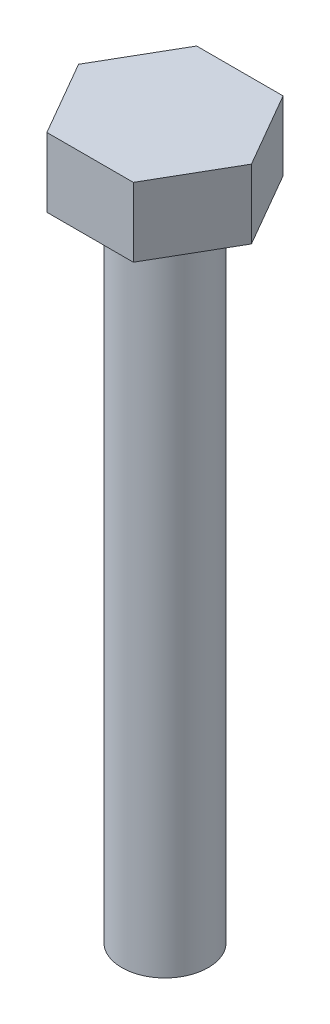
ISO-10303-21;
HEADER;
FILE_DESCRIPTION(('STEP AP214'),'2;1');
FILE_NAME('part.step','',(''),(''),'','','');
FILE_SCHEMA(('AUTOMOTIVE_DESIGN { 1 0 10303 214 1 1 1 1 }'));
ENDSEC;
DATA;
#1=APPLICATION_CONTEXT('core data for automotive mechanical design processes');
#2=APPLICATION_PROTOCOL_DEFINITION('international standard','automotive_design',2000,#1);
#3=PRODUCT_CONTEXT('',#1,'mechanical');
#4=PRODUCT('Part','Part','',(#3));
#5=PRODUCT_RELATED_PRODUCT_CATEGORY('part','',(#4));
#6=PRODUCT_DEFINITION_FORMATION('','',#4);
#7=PRODUCT_DEFINITION_CONTEXT('part definition',#1,'design');
#8=PRODUCT_DEFINITION('design','',#6,#7);
#9=PRODUCT_DEFINITION_SHAPE('','',#8);
#10=(LENGTH_UNIT() NAMED_UNIT(*) SI_UNIT(.MILLI.,.METRE.));
#11=(NAMED_UNIT(*) PLANE_ANGLE_UNIT() SI_UNIT($,.RADIAN.));
#12=(NAMED_UNIT(*) SI_UNIT($,.STERADIAN.) SOLID_ANGLE_UNIT());
#13=UNCERTAINTY_MEASURE_WITH_UNIT(LENGTH_MEASURE(1.E-05),#10,'distance_accuracy_value','');
#14=(GEOMETRIC_REPRESENTATION_CONTEXT(3) GLOBAL_UNCERTAINTY_ASSIGNED_CONTEXT((#13)) GLOBAL_UNIT_ASSIGNED_CONTEXT((#10,
#11,#12)) REPRESENTATION_CONTEXT('',''));
#15=CARTESIAN_POINT('',(0.,0.,0.));
#16=DIRECTION('',(0.,0.,1.));
#17=DIRECTION('',(1.,0.,0.));
#18=AXIS2_PLACEMENT_3D('',#15,#16,#17);
#19=CARTESIAN_POINT('',(0.,75.,0.));
#20=DIRECTION('',(0.,-1.,0.));
#21=DIRECTION('',(0.,0.,-1.));
#22=AXIS2_PLACEMENT_3D('',#19,#20,#21);
#23=CYLINDRICAL_SURFACE('',#22,5.);
#24=CARTESIAN_POINT('',(0.,75.,0.));
#25=DIRECTION('',(0.,1.,0.));
#26=DIRECTION('',(0.,0.,1.));
#27=AXIS2_PLACEMENT_3D('',#24,#25,#26);
#28=CIRCLE('',#27,5.);
#29=CARTESIAN_POINT('',(0.,75.,5.));
#30=VERTEX_POINT('',#29);
#31=EDGE_CURVE('E11',#30,#30,#28,.T.);
#32=ORIENTED_EDGE('',*,*,#31,.F.);
#33=EDGE_LOOP('',(#32));
#34=FACE_BOUND('',#33,.T.);
#35=CARTESIAN_POINT('',(0.,0.,0.));
#36=DIRECTION('',(0.,1.,0.));
#37=DIRECTION('',(0.,0.,1.));
#38=AXIS2_PLACEMENT_3D('',#35,#36,#37);
#39=CIRCLE('',#38,5.);
#40=CARTESIAN_POINT('',(0.,0.,5.));
#41=VERTEX_POINT('',#40);
#42=EDGE_CURVE('E36',#41,#41,#39,.T.);
#43=ORIENTED_EDGE('',*,*,#42,.T.);
#44=EDGE_LOOP('',(#43));
#45=FACE_BOUND('',#44,.T.);
#46=ADVANCED_FACE('F33',(#34,#45),#23,.T.);
#47=CARTESIAN_POINT('',(0.,0.,0.));
#48=DIRECTION('',(0.,1.,0.));
#49=DIRECTION('',(0.,0.,1.));
#50=AXIS2_PLACEMENT_3D('',#47,#48,#49);
#51=PLANE('',#50);
#52=ORIENTED_EDGE('',*,*,#42,.F.);
#53=EDGE_LOOP('',(#52));
#54=FACE_BOUND('',#53,.T.);
#55=ADVANCED_FACE('F141',(#54),#51,.F.);
#56=CARTESIAN_POINT('',(-9.99999999999998,83.,0.));
#57=DIRECTION('',(0.86602540378444,0.,0.499999999999998));
#58=DIRECTION('',(0.499999999999998,0.,-0.86602540378444));
#59=AXIS2_PLACEMENT_3D('',#56,#57,#58);
#60=PLANE('',#59);
#61=DIRECTION('',(-0.499999999999998,0.,0.86602540378444));
#62=VECTOR('',#61,1.);
#63=CARTESIAN_POINT('',(-9.99999999999998,75.,0.));
#64=LINE('',#63,#62);
#65=CARTESIAN_POINT('',(-5.,75.,-8.66025403784436));
#66=VERTEX_POINT('',#65);
#67=CARTESIAN_POINT('',(-9.99999999999998,75.,0.));
#68=VERTEX_POINT('',#67);
#69=EDGE_CURVE('E118',#66,#68,#64,.T.);
#70=ORIENTED_EDGE('',*,*,#69,.T.);
#71=DIRECTION('',(0.,-1.,0.));
#72=VECTOR('',#71,1.);
#73=CARTESIAN_POINT('',(-9.99999999999998,83.,0.));
#74=LINE('',#73,#72);
#75=CARTESIAN_POINT('',(-9.99999999999998,83.,0.));
#76=VERTEX_POINT('',#75);
#77=EDGE_CURVE('E135',#76,#68,#74,.T.);
#78=ORIENTED_EDGE('',*,*,#77,.F.);
#79=DIRECTION('',(-0.499999999999998,0.,0.86602540378444));
#80=VECTOR('',#79,1.);
#81=CARTESIAN_POINT('',(-9.99999999999998,83.,0.));
#82=LINE('',#81,#80);
#83=CARTESIAN_POINT('',(-5.,83.,-8.66025403784436));
#84=VERTEX_POINT('',#83);
#85=EDGE_CURVE('E128',#84,#76,#82,.T.);
#86=ORIENTED_EDGE('',*,*,#85,.F.);
#87=DIRECTION('',(0.,-1.,0.));
#88=VECTOR('',#87,1.);
#89=CARTESIAN_POINT('',(-5.,83.,-8.66025403784436));
#90=LINE('',#89,#88);
#91=EDGE_CURVE('E114',#84,#66,#90,.T.);
#92=ORIENTED_EDGE('',*,*,#91,.T.);
#93=EDGE_LOOP('',(#70,#78,#86,#92));
#94=FACE_BOUND('',#93,.T.);
#95=ADVANCED_FACE('F143',(#94),#60,.F.);
#96=CARTESIAN_POINT('',(-4.99999999999996,83.,8.66025403784441));
#97=DIRECTION('',(0.866025403784437,0.,-0.500000000000002));
#98=DIRECTION('',(-0.500000000000002,0.,-0.866025403784437));
#99=AXIS2_PLACEMENT_3D('',#96,#97,#98);
#100=PLANE('',#99);
#101=DIRECTION('',(0.500000000000002,0.,0.866025403784437));
#102=VECTOR('',#101,1.);
#103=CARTESIAN_POINT('',(-4.99999999999996,75.,8.66025403784441));
#104=LINE('',#103,#102);
#105=CARTESIAN_POINT('',(-4.99999999999996,75.,8.66025403784441));
#106=VERTEX_POINT('',#105);
#107=EDGE_CURVE('E121',#68,#106,#104,.T.);
#108=ORIENTED_EDGE('',*,*,#107,.T.);
#109=DIRECTION('',(0.,-1.,0.));
#110=VECTOR('',#109,1.);
#111=CARTESIAN_POINT('',(-4.99999999999996,83.,8.66025403784441));
#112=LINE('',#111,#110);
#113=CARTESIAN_POINT('',(-4.99999999999996,83.,8.66025403784441));
#114=VERTEX_POINT('',#113);
#115=EDGE_CURVE('E132',#114,#106,#112,.T.);
#116=ORIENTED_EDGE('',*,*,#115,.F.);
#117=DIRECTION('',(0.500000000000002,0.,0.866025403784437));
#118=VECTOR('',#117,1.);
#119=CARTESIAN_POINT('',(-4.99999999999996,83.,8.66025403784441));
#120=LINE('',#119,#118);
#121=EDGE_CURVE('E87',#76,#114,#120,.T.);
#122=ORIENTED_EDGE('',*,*,#121,.F.);
#123=ORIENTED_EDGE('',*,*,#77,.T.);
#124=EDGE_LOOP('',(#108,#116,#122,#123));
#125=FACE_BOUND('',#124,.T.);
#126=ADVANCED_FACE('F148',(#125),#100,.F.);
#127=CARTESIAN_POINT('',(5.00000000000004,83.,8.66025403784443));
#128=DIRECTION('',(0.,0.,-1.));
#129=DIRECTION('',(-1.,0.,0.));
#130=AXIS2_PLACEMENT_3D('',#127,#128,#129);
#131=PLANE('',#130);
#132=DIRECTION('',(1.,0.,0.));
#133=VECTOR('',#132,1.);
#134=CARTESIAN_POINT('',(5.00000000000004,75.,8.66025403784443));
#135=LINE('',#134,#133);
#136=CARTESIAN_POINT('',(5.00000000000004,75.,8.66025403784443));
#137=VERTEX_POINT('',#136);
#138=EDGE_CURVE('E123',#106,#137,#135,.T.);
#139=ORIENTED_EDGE('',*,*,#138,.T.);
#140=DIRECTION('',(0.,-1.,0.));
#141=VECTOR('',#140,1.);
#142=CARTESIAN_POINT('',(5.00000000000004,83.,8.66025403784443));
#143=LINE('',#142,#141);
#144=CARTESIAN_POINT('',(5.00000000000004,83.,8.66025403784443));
#145=VERTEX_POINT('',#144);
#146=EDGE_CURVE('E109',#145,#137,#143,.T.);
#147=ORIENTED_EDGE('',*,*,#146,.F.);
#148=DIRECTION('',(1.,0.,0.));
#149=VECTOR('',#148,1.);
#150=CARTESIAN_POINT('',(5.00000000000004,83.,8.66025403784443));
#151=LINE('',#150,#149);
#152=EDGE_CURVE('E100',#114,#145,#151,.T.);
#153=ORIENTED_EDGE('',*,*,#152,.F.);
#154=ORIENTED_EDGE('',*,*,#115,.T.);
#155=EDGE_LOOP('',(#139,#147,#153,#154));
#156=FACE_BOUND('',#155,.T.);
#157=ADVANCED_FACE('F155',(#156),#131,.F.);
#158=CARTESIAN_POINT('',(10.,83.,0.));
#159=DIRECTION('',(-0.866025403784439,0.,-0.5));
#160=DIRECTION('',(-0.5,0.,0.866025403784439));
#161=AXIS2_PLACEMENT_3D('',#158,#159,#160);
#162=PLANE('',#161);
#163=DIRECTION('',(0.5,0.,-0.866025403784439));
#164=VECTOR('',#163,1.);
#165=CARTESIAN_POINT('',(10.,75.,0.));
#166=LINE('',#165,#164);
#167=CARTESIAN_POINT('',(10.,75.,0.));
#168=VERTEX_POINT('',#167);
#169=EDGE_CURVE('E108',#137,#168,#166,.T.);
#170=ORIENTED_EDGE('',*,*,#169,.T.);
#171=DIRECTION('',(0.,-1.,0.));
#172=VECTOR('',#171,1.);
#173=CARTESIAN_POINT('',(10.,83.,0.));
#174=LINE('',#173,#172);
#175=CARTESIAN_POINT('',(10.,83.,0.));
#176=VERTEX_POINT('',#175);
#177=EDGE_CURVE('E105',#176,#168,#174,.T.);
#178=ORIENTED_EDGE('',*,*,#177,.F.);
#179=DIRECTION('',(0.5,0.,-0.866025403784439));
#180=VECTOR('',#179,1.);
#181=CARTESIAN_POINT('',(10.,83.,0.));
#182=LINE('',#181,#180);
#183=EDGE_CURVE('E94',#145,#176,#182,.T.);
#184=ORIENTED_EDGE('',*,*,#183,.F.);
#185=ORIENTED_EDGE('',*,*,#146,.T.);
#186=EDGE_LOOP('',(#170,#178,#184,#185));
#187=FACE_BOUND('',#186,.T.);
#188=ADVANCED_FACE('F106',(#187),#162,.F.);
#189=CARTESIAN_POINT('',(5.,83.,-8.66025403784436));
#190=DIRECTION('',(-0.866025403784437,0.,0.500000000000003));
#191=DIRECTION('',(0.500000000000002,0.,0.866025403784437));
#192=AXIS2_PLACEMENT_3D('',#189,#190,#191);
#193=PLANE('',#192);
#194=DIRECTION('',(-0.500000000000002,0.,-0.866025403784437));
#195=VECTOR('',#194,1.);
#196=CARTESIAN_POINT('',(5.,75.,-8.66025403784436));
#197=LINE('',#196,#195);
#198=CARTESIAN_POINT('',(5.,75.,-8.66025403784436));
#199=VERTEX_POINT('',#198);
#200=EDGE_CURVE('E72',#168,#199,#197,.T.);
#201=ORIENTED_EDGE('',*,*,#200,.T.);
#202=DIRECTION('',(0.,-1.,0.));
#203=VECTOR('',#202,1.);
#204=CARTESIAN_POINT('',(5.,83.,-8.66025403784436));
#205=LINE('',#204,#203);
#206=CARTESIAN_POINT('',(5.,83.,-8.66025403784436));
#207=VERTEX_POINT('',#206);
#208=EDGE_CURVE('E110',#207,#199,#205,.T.);
#209=ORIENTED_EDGE('',*,*,#208,.F.);
#210=DIRECTION('',(-0.500000000000002,0.,-0.866025403784437));
#211=VECTOR('',#210,1.);
#212=CARTESIAN_POINT('',(5.,83.,-8.66025403784436));
#213=LINE('',#212,#211);
#214=EDGE_CURVE('E98',#176,#207,#213,.T.);
#215=ORIENTED_EDGE('',*,*,#214,.F.);
#216=ORIENTED_EDGE('',*,*,#177,.T.);
#217=EDGE_LOOP('',(#201,#209,#215,#216));
#218=FACE_BOUND('',#217,.T.);
#219=ADVANCED_FACE('F112',(#218),#193,.F.);
#220=CARTESIAN_POINT('',(-5.,83.,-8.66025403784436));
#221=DIRECTION('',(0.,0.,1.));
#222=DIRECTION('',(1.,0.,0.));
#223=AXIS2_PLACEMENT_3D('',#220,#221,#222);
#224=PLANE('',#223);
#225=DIRECTION('',(-1.,0.,0.));
#226=VECTOR('',#225,1.);
#227=CARTESIAN_POINT('',(-5.,75.,-8.66025403784436));
#228=LINE('',#227,#226);
#229=EDGE_CURVE('E78',#199,#66,#228,.T.);
#230=ORIENTED_EDGE('',*,*,#229,.T.);
#231=ORIENTED_EDGE('',*,*,#91,.F.);
#232=DIRECTION('',(-1.,0.,0.));
#233=VECTOR('',#232,1.);
#234=CARTESIAN_POINT('',(-5.,83.,-8.66025403784436));
#235=LINE('',#234,#233);
#236=EDGE_CURVE('E49',#207,#84,#235,.T.);
#237=ORIENTED_EDGE('',*,*,#236,.F.);
#238=ORIENTED_EDGE('',*,*,#208,.T.);
#239=EDGE_LOOP('',(#230,#231,#237,#238));
#240=FACE_BOUND('',#239,.T.);
#241=ADVANCED_FACE('F163',(#240),#224,.F.);
#242=CARTESIAN_POINT('',(0.,83.,0.));
#243=DIRECTION('',(0.,-1.,0.));
#244=DIRECTION('',(0.,0.,-1.));
#245=AXIS2_PLACEMENT_3D('',#242,#243,#244);
#246=PLANE('',#245);
#247=ORIENTED_EDGE('',*,*,#85,.T.);
#248=ORIENTED_EDGE('',*,*,#121,.T.);
#249=ORIENTED_EDGE('',*,*,#152,.T.);
#250=ORIENTED_EDGE('',*,*,#183,.T.);
#251=ORIENTED_EDGE('',*,*,#214,.T.);
#252=ORIENTED_EDGE('',*,*,#236,.T.);
#253=EDGE_LOOP('',(#247,#248,#249,#250,#251,#252));
#254=FACE_BOUND('',#253,.T.);
#255=ADVANCED_FACE('F96',(#254),#246,.F.);
#256=CARTESIAN_POINT('',(0.,75.,0.));
#257=DIRECTION('',(0.,-1.,0.));
#258=DIRECTION('',(0.,0.,-1.));
#259=AXIS2_PLACEMENT_3D('',#256,#257,#258);
#260=PLANE('',#259);
#261=ORIENTED_EDGE('',*,*,#31,.T.);
#262=EDGE_LOOP('',(#261));
#263=FACE_BOUND('',#262,.T.);
#264=ORIENTED_EDGE('',*,*,#69,.F.);
#265=ORIENTED_EDGE('',*,*,#229,.F.);
#266=ORIENTED_EDGE('',*,*,#200,.F.);
#267=ORIENTED_EDGE('',*,*,#169,.F.);
#268=ORIENTED_EDGE('',*,*,#138,.F.);
#269=ORIENTED_EDGE('',*,*,#107,.F.);
#270=EDGE_LOOP('',(#264,#265,#266,#267,#268,#269));
#271=FACE_BOUND('',#270,.T.);
#272=ADVANCED_FACE('F166',(#263,#271),#260,.T.);
#273=CLOSED_SHELL('',(#46,#55,#95,#126,#157,#188,#219,#241,#255,#272));
#274=MANIFOLD_SOLID_BREP('B2',#273);
#275=ADVANCED_BREP_SHAPE_REPRESENTATION('',(#18,#274),#14);
#276=SHAPE_DEFINITION_REPRESENTATION(#9,#275);
ENDSEC;
END-ISO-10303-21;
